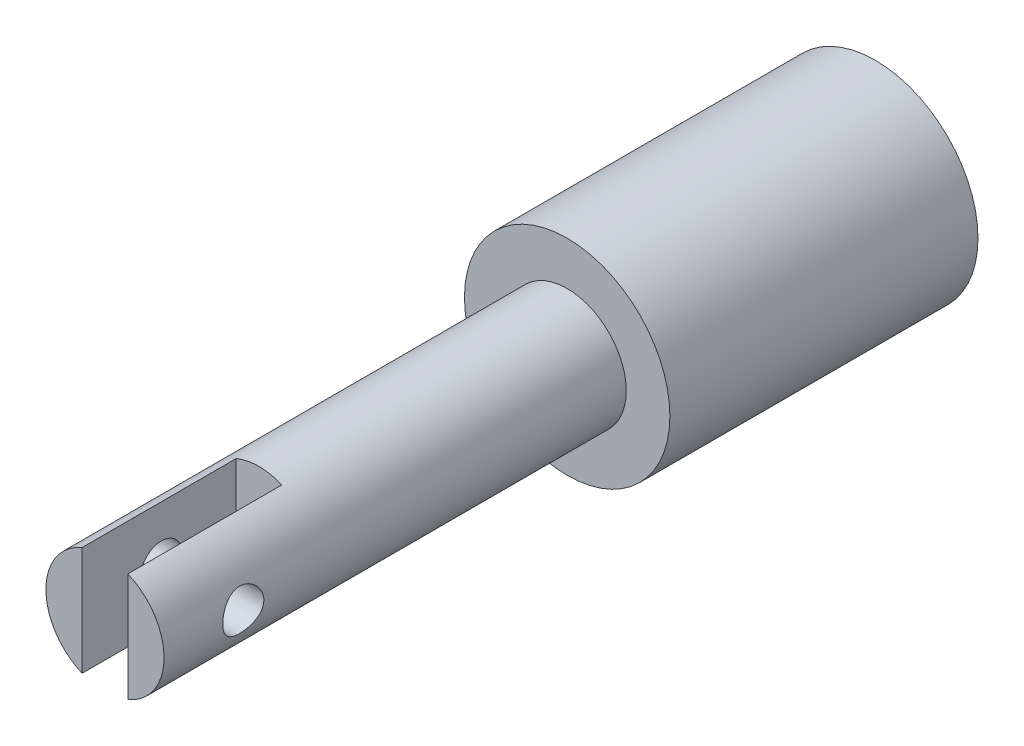
ISO-10303-21;
HEADER;
FILE_DESCRIPTION(('STEP AP214'),'2;1');
FILE_NAME('part.step','',(''),(''),'','','');
FILE_SCHEMA(('AUTOMOTIVE_DESIGN { 1 0 10303 214 1 1 1 1 }'));
ENDSEC;
DATA;
#1=APPLICATION_CONTEXT('core data for automotive mechanical design processes');
#2=APPLICATION_PROTOCOL_DEFINITION('international standard','automotive_design',2000,#1);
#3=PRODUCT_CONTEXT('',#1,'mechanical');
#4=PRODUCT('Part','Part','',(#3));
#5=PRODUCT_RELATED_PRODUCT_CATEGORY('part','',(#4));
#6=PRODUCT_DEFINITION_FORMATION('','',#4);
#7=PRODUCT_DEFINITION_CONTEXT('part definition',#1,'design');
#8=PRODUCT_DEFINITION('design','',#6,#7);
#9=PRODUCT_DEFINITION_SHAPE('','',#8);
#10=(LENGTH_UNIT() NAMED_UNIT(*) SI_UNIT(.MILLI.,.METRE.));
#11=(NAMED_UNIT(*) PLANE_ANGLE_UNIT() SI_UNIT($,.RADIAN.));
#12=(NAMED_UNIT(*) SI_UNIT($,.STERADIAN.) SOLID_ANGLE_UNIT());
#13=UNCERTAINTY_MEASURE_WITH_UNIT(LENGTH_MEASURE(1.E-05),#10,'distance_accuracy_value','');
#14=(GEOMETRIC_REPRESENTATION_CONTEXT(3) GLOBAL_UNCERTAINTY_ASSIGNED_CONTEXT((#13)) GLOBAL_UNIT_ASSIGNED_CONTEXT((#10,
#11,#12)) REPRESENTATION_CONTEXT('',''));
#15=CARTESIAN_POINT('',(0.,0.,0.));
#16=DIRECTION('',(0.,0.,1.));
#17=DIRECTION('',(1.,0.,0.));
#18=AXIS2_PLACEMENT_3D('',#15,#16,#17);
#19=CARTESIAN_POINT('',(0.,0.,60.));
#20=DIRECTION('',(0.,0.,1.));
#21=DIRECTION('',(1.,0.,0.));
#22=AXIS2_PLACEMENT_3D('',#19,#20,#21);
#23=PLANE('',#22);
#24=CARTESIAN_POINT('',(0.,0.,60.));
#25=DIRECTION('',(0.,0.,1.));
#26=DIRECTION('',(1.,0.,0.));
#27=AXIS2_PLACEMENT_3D('',#24,#25,#26);
#28=CIRCLE('',#27,5.75258948326963);
#29=CARTESIAN_POINT('',(-2.2252248524531,-5.30477710361608,60.));
#30=VERTEX_POINT('',#29);
#31=CARTESIAN_POINT('',(2.2252248524531,-5.30477710361608,60.));
#32=VERTEX_POINT('',#31);
#33=EDGE_CURVE('E108',#30,#32,#28,.T.);
#34=ORIENTED_EDGE('',*,*,#33,.T.);
#35=DIRECTION('',(0.,-1.,0.));
#36=VECTOR('',#35,1.);
#37=CARTESIAN_POINT('',(2.2252248524531,5.30477710361608,60.));
#38=LINE('',#37,#36);
#39=CARTESIAN_POINT('',(2.2252248524531,5.30477710361608,60.));
#40=VERTEX_POINT('',#39);
#41=EDGE_CURVE('E85',#40,#32,#38,.T.);
#42=ORIENTED_EDGE('',*,*,#41,.F.);
#43=CARTESIAN_POINT('',(-2.2252248524531,5.30477710361608,60.));
#44=VERTEX_POINT('',#43);
#45=EDGE_CURVE('E91',#40,#44,#28,.T.);
#46=ORIENTED_EDGE('',*,*,#45,.T.);
#47=DIRECTION('',(0.,1.,0.));
#48=VECTOR('',#47,1.);
#49=CARTESIAN_POINT('',(-2.2252248524531,5.30477710361608,60.));
#50=LINE('',#49,#48);
#51=EDGE_CURVE('E57',#30,#44,#50,.T.);
#52=ORIENTED_EDGE('',*,*,#51,.F.);
#53=EDGE_LOOP('',(#34,#42,#46,#52));
#54=FACE_BOUND('',#53,.T.);
#55=ADVANCED_FACE('F32',(#54),#23,.T.);
#56=CARTESIAN_POINT('',(0.,0.,30.));
#57=DIRECTION('',(0.,0.,-1.));
#58=DIRECTION('',(-1.,0.,0.));
#59=AXIS2_PLACEMENT_3D('',#56,#57,#58);
#60=CYLINDRICAL_SURFACE('',#59,10.);
#61=CARTESIAN_POINT('',(0.,0.,30.));
#62=DIRECTION('',(0.,0.,1.));
#63=DIRECTION('',(1.,0.,0.));
#64=AXIS2_PLACEMENT_3D('',#61,#62,#63);
#65=CIRCLE('',#64,10.);
#66=CARTESIAN_POINT('',(10.,0.,30.));
#67=VERTEX_POINT('',#66);
#68=EDGE_CURVE('E11',#67,#67,#65,.T.);
#69=ORIENTED_EDGE('',*,*,#68,.F.);
#70=EDGE_LOOP('',(#69));
#71=FACE_BOUND('',#70,.T.);
#72=CARTESIAN_POINT('',(0.,0.,0.));
#73=DIRECTION('',(0.,0.,1.));
#74=DIRECTION('',(1.,0.,0.));
#75=AXIS2_PLACEMENT_3D('',#72,#73,#74);
#76=CIRCLE('',#75,10.);
#77=CARTESIAN_POINT('',(10.,0.,0.));
#78=VERTEX_POINT('',#77);
#79=EDGE_CURVE('E41',#78,#78,#76,.T.);
#80=ORIENTED_EDGE('',*,*,#79,.T.);
#81=EDGE_LOOP('',(#80));
#82=FACE_BOUND('',#81,.T.);
#83=ADVANCED_FACE('F34',(#71,#82),#60,.T.);
#84=CARTESIAN_POINT('',(0.,0.,30.));
#85=DIRECTION('',(0.,0.,1.));
#86=DIRECTION('',(1.,0.,0.));
#87=AXIS2_PLACEMENT_3D('',#84,#85,#86);
#88=PLANE('',#87);
#89=CARTESIAN_POINT('',(0.,0.,30.));
#90=DIRECTION('',(0.,0.,1.));
#91=DIRECTION('',(1.,0.,0.));
#92=AXIS2_PLACEMENT_3D('',#89,#90,#91);
#93=CIRCLE('',#92,5.75258948326963);
#94=CARTESIAN_POINT('',(5.75258948326963,0.,30.));
#95=VERTEX_POINT('',#94);
#96=EDGE_CURVE('E105',#95,#95,#93,.T.);
#97=ORIENTED_EDGE('',*,*,#96,.F.);
#98=EDGE_LOOP('',(#97));
#99=FACE_BOUND('',#98,.T.);
#100=ORIENTED_EDGE('',*,*,#68,.T.);
#101=EDGE_LOOP('',(#100));
#102=FACE_BOUND('',#101,.T.);
#103=ADVANCED_FACE('F145',(#99,#102),#88,.T.);
#104=CARTESIAN_POINT('',(0.,0.,0.));
#105=DIRECTION('',(0.,0.,1.));
#106=DIRECTION('',(1.,0.,0.));
#107=AXIS2_PLACEMENT_3D('',#104,#105,#106);
#108=PLANE('',#107);
#109=ORIENTED_EDGE('',*,*,#79,.F.);
#110=EDGE_LOOP('',(#109));
#111=FACE_BOUND('',#110,.T.);
#112=ADVANCED_FACE('F151',(#111),#108,.F.);
#113=CARTESIAN_POINT('',(0.,0.,60.));
#114=DIRECTION('',(0.,0.,-1.));
#115=DIRECTION('',(-1.,0.,0.));
#116=AXIS2_PLACEMENT_3D('',#113,#114,#115);
#117=CYLINDRICAL_SURFACE('',#116,5.75258948326963);
#118=CARTESIAN_POINT('',(-5.75258948326963,0.,69.2843926625045));
#119=CARTESIAN_POINT('',(-5.75259053411721,-0.108855988491879,69.2843941746644));
#120=CARTESIAN_POINT('',(-5.74947169212244,-0.217701202775094,69.2754768628789));
#121=CARTESIAN_POINT('',(-5.73733861407755,-0.432169586322584,69.2401639139545));
#122=CARTESIAN_POINT('',(-5.72832426967222,-0.537792696329485,69.21376795557));
#123=CARTESIAN_POINT('',(-5.70537577643332,-0.742694046036642,69.1445231049895));
#124=CARTESIAN_POINT('',(-5.69145028382106,-0.841983088664504,69.1017031496118));
#125=CARTESIAN_POINT('',(-5.66008926714514,-1.03196805310706,69.0009620716715));
#126=CARTESIAN_POINT('',(-5.64265295974575,-1.1226620505352,68.9430375781199));
#127=CARTESIAN_POINT('',(-5.6053668531092,-1.29626382949066,68.8114675335434));
#128=CARTESIAN_POINT('',(-5.58545563224186,-1.37880745670492,68.737359023693));
#129=CARTESIAN_POINT('',(-5.54578947926593,-1.53057827327527,68.5765082083348));
#130=CARTESIAN_POINT('',(-5.52603458690332,-1.599802174233,68.4897627922685));
#131=CARTESIAN_POINT('',(-5.48822939154141,-1.7251244375781,68.3027300366945));
#132=CARTESIAN_POINT('',(-5.47025318510754,-1.78073591685119,68.2021000185026));
#133=CARTESIAN_POINT('',(-5.43898184665961,-1.87408748238633,67.9921901289735));
#134=CARTESIAN_POINT('',(-5.42568514215385,-1.91183357357567,67.8829131784846));
#135=CARTESIAN_POINT('',(-5.40592830011995,-1.96699276968032,67.6629718410679));
#136=CARTESIAN_POINT('',(-5.39923800795687,-1.98509275069389,67.5525010313599));
#137=CARTESIAN_POINT('',(-5.39277292397934,-2.00259368272225,67.3299033540334));
#138=CARTESIAN_POINT('',(-5.39299576786205,-2.00200102664568,67.217777065704));
#139=CARTESIAN_POINT('',(-5.40013115290795,-1.98266407961782,67.0010446336499));
#140=CARTESIAN_POINT('',(-5.40670674057703,-1.96483403837285,66.8963438590908));
#141=CARTESIAN_POINT('',(-5.42525248225017,-1.91302651531002,66.6915247889198));
#142=CARTESIAN_POINT('',(-5.43722333576657,-1.87904693962558,66.5914070893719));
#143=CARTESIAN_POINT('',(-5.46543821079442,-1.79533932524431,66.3965907920864));
#144=CARTESIAN_POINT('',(-5.48175183010446,-1.74535182178022,66.3020141982613));
#145=CARTESIAN_POINT('',(-5.51678692430243,-1.63122755916939,66.1223104279583));
#146=CARTESIAN_POINT('',(-5.53550914166159,-1.56708643266673,66.0371861803864));
#147=CARTESIAN_POINT('',(-5.57455843055329,-1.42215388121245,65.8736904241432));
#148=CARTESIAN_POINT('',(-5.59491608718582,-1.34062067638806,65.7959823446195));
#149=CARTESIAN_POINT('',(-5.63401240786343,-1.16543357343047,65.655160907104));
#150=CARTESIAN_POINT('',(-5.65275088796578,-1.07177830120937,65.5920492059376));
#151=CARTESIAN_POINT('',(-5.68678254845073,-0.873504585879797,65.4816143672457));
#152=CARTESIAN_POINT('',(-5.70203316251366,-0.768771392431339,65.4344832223857));
#153=CARTESIAN_POINT('',(-5.72705985953034,-0.552203916325494,65.3587194664259));
#154=CARTESIAN_POINT('',(-5.7368380186956,-0.440372344697399,65.3300798391378));
#155=CARTESIAN_POINT('',(-5.74946710663383,-0.218388190912261,65.2933204340174));
#156=CARTESIAN_POINT('',(-5.75262006728984,-0.108400881477266,65.2843052684141));
#157=CARTESIAN_POINT('',(-5.75255846954564,0.111545778297261,65.2844812926565));
#158=CARTESIAN_POINT('',(-5.74934509419839,0.221505130034496,65.2936690998531));
#159=CARTESIAN_POINT('',(-5.73711148792043,0.434596479440953,65.3292902565837));
#160=CARTESIAN_POINT('',(-5.72828054608559,0.537834347705573,65.3551618088661));
#161=CARTESIAN_POINT('',(-5.70588903145768,0.738452895680869,65.4227013494959));
#162=CARTESIAN_POINT('',(-5.69232784760204,0.835832816743127,65.4643713787842));
#163=CARTESIAN_POINT('',(-5.66137631391049,1.0249605698158,65.563586856917));
#164=CARTESIAN_POINT('',(-5.64389093838812,1.11647994969065,65.6215372755021));
#165=CARTESIAN_POINT('',(-5.60705883169998,1.28877935690095,65.7511992900248));
#166=CARTESIAN_POINT('',(-5.58771149035221,1.36955584290102,65.8229154048074));
#167=CARTESIAN_POINT('',(-5.54811269214,1.52225640453584,65.9822762160987));
#168=CARTESIAN_POINT('',(-5.52786402383469,1.59354209412099,66.070534841917));
#169=CARTESIAN_POINT('',(-5.48971400936692,1.72038568653267,66.2581873892244));
#170=CARTESIAN_POINT('',(-5.47181273576928,1.77594310321383,66.3575816547727));
#171=CARTESIAN_POINT('',(-5.44053326580354,1.86958124666382,66.5649496742323));
#172=CARTESIAN_POINT('',(-5.42715371974194,1.90766718971976,66.6729208561085));
#173=CARTESIAN_POINT('',(-5.40669251537863,1.96491835319779,66.8943250402634));
#174=CARTESIAN_POINT('',(-5.39960768319946,1.98409310942613,67.0077552595743));
#175=CARTESIAN_POINT('',(-5.39291981565268,2.00219514233583,67.2300523490607));
#176=CARTESIAN_POINT('',(-5.39292177017308,2.0021914032755,67.3388211743172));
#177=CARTESIAN_POINT('',(-5.39941854852333,1.98460348708628,67.5547202167937));
#178=CARTESIAN_POINT('',(-5.40591291786515,1.96702054055336,67.66185054818));
#179=CARTESIAN_POINT('',(-5.42435649212921,1.91555702951829,67.8690142756019));
#180=CARTESIAN_POINT('',(-5.43617964078807,1.88205216593226,67.9691531316865));
#181=CARTESIAN_POINT('',(-5.46389258527493,1.80000819760074,68.1624602332107));
#182=CARTESIAN_POINT('',(-5.47978333067681,1.75146558175931,68.2556268444187));
#183=CARTESIAN_POINT('',(-5.51476596697837,1.63808234861348,68.4370673033435));
#184=CARTESIAN_POINT('',(-5.53397272856322,1.57258625353205,68.5249092102518));
#185=CARTESIAN_POINT('',(-5.57297262672439,1.42823162209781,68.6886997536277));
#186=CARTESIAN_POINT('',(-5.59276593448987,1.34936915230496,68.7646448764286));
#187=CARTESIAN_POINT('',(-5.63174973964916,1.17637908043968,68.9058525949062));
#188=CARTESIAN_POINT('',(-5.65087586967256,1.08173418709223,68.9705016590633));
#189=CARTESIAN_POINT('',(-5.68542930940269,0.88227394560066,69.0829173707566));
#190=CARTESIAN_POINT('',(-5.70085717543276,0.777460130485929,69.1306865580161));
#191=CARTESIAN_POINT('',(-5.72605176875095,0.562278011044186,69.2070648193902));
#192=CARTESIAN_POINT('',(-5.73590350335438,0.452022628597252,69.2359626947113));
#193=CARTESIAN_POINT('',(-5.74917071482245,0.227840055244764,69.2746225666146));
#194=CARTESIAN_POINT('',(-5.75258838359301,0.113914128248559,69.28439108008));
#195=CARTESIAN_POINT('',(-5.75258948326963,0.,69.2843926625045));
#196=B_SPLINE_CURVE_WITH_KNOTS('',3,(#118,#119,#120,#121,#122,#123,#124,#125,#126,#127,#128,
#129,#130,#131,#132,#133,#134,#135,#136,#137,#138,#139,#140,#141,#142,#143,#144,#145,#146,#147,
#148,#149,#150,#151,#152,#153,#154,#155,#156,#157,#158,#159,#160,#161,#162,#163,#164,#165,#166,
#167,#168,#169,#170,#171,#172,#173,#174,#175,#176,#177,#178,#179,#180,#181,#182,#183,#184,#185,
#186,#187,#188,#189,#190,#191,#192,#193,#194,#195),.UNSPECIFIED.,.T.,.F.,(4,2,2,2,2,2,2,2,2,2,2,
2,2,2,2,2,2,2,2,2,2,2,2,2,2,2,2,2,2,2,2,2,2,2,2,2,2,2,4),(0.,0.326148429754415,
0.652302854057864,0.977885259388556,1.30354038957929,1.64014099385261,1.97682459237359,
2.32420491303538,2.67146838890515,3.00615528411285,3.34072771716524,3.65847624582909,
3.97626598339573,4.29949214814239,4.62281818997479,4.96461218942227,5.30644496665971,
5.65224999798738,5.99792374418702,6.32746284251182,6.65694070849767,6.97586546185769,
7.2948314298543,7.6225668172479,7.95040997442065,8.29452549118705,8.63865164306295,
8.98267498558225,9.32652476841024,9.65120903436534,9.97587057306303,10.2932252675554,
10.6106541156616,10.942913022336,11.2752698760539,11.6221828224625,11.9690435505738,
12.3104632384896,12.6517665932231),.UNSPECIFIED.);
#197=CARTESIAN_POINT('',(-5.75258948326963,0.,69.2843926625045));
#198=VERTEX_POINT('',#197);
#199=EDGE_CURVE('E161',#198,#198,#196,.T.);
#200=ORIENTED_EDGE('',*,*,#199,.T.);
#201=EDGE_LOOP('',(#200));
#202=FACE_BOUND('',#201,.T.);
#203=CARTESIAN_POINT('',(5.75258948326963,0.,69.2843926625045));
#204=CARTESIAN_POINT('',(5.75259053411721,0.108855988491879,69.2843941746644));
#205=CARTESIAN_POINT('',(5.74947169212244,0.217701202775094,69.2754768628789));
#206=CARTESIAN_POINT('',(5.73733861407755,0.432169586322584,69.2401639139545));
#207=CARTESIAN_POINT('',(5.72832426967222,0.537792696329485,69.21376795557));
#208=CARTESIAN_POINT('',(5.70537577643332,0.742694046036642,69.1445231049895));
#209=CARTESIAN_POINT('',(5.69145028382106,0.841983088664504,69.1017031496118));
#210=CARTESIAN_POINT('',(5.66008926714514,1.03196805310706,69.0009620716715));
#211=CARTESIAN_POINT('',(5.64265295974575,1.1226620505352,68.9430375781199));
#212=CARTESIAN_POINT('',(5.6053668531092,1.29626382949066,68.8114675335434));
#213=CARTESIAN_POINT('',(5.58545563224186,1.37880745670492,68.737359023693));
#214=CARTESIAN_POINT('',(5.54578947926593,1.53057827327527,68.5765082083348));
#215=CARTESIAN_POINT('',(5.52603458690332,1.599802174233,68.4897627922685));
#216=CARTESIAN_POINT('',(5.48822939154141,1.7251244375781,68.3027300366945));
#217=CARTESIAN_POINT('',(5.47025318510754,1.78073591685119,68.2021000185026));
#218=CARTESIAN_POINT('',(5.43898184665961,1.87408748238633,67.9921901289735));
#219=CARTESIAN_POINT('',(5.42568514215385,1.91183357357567,67.8829131784846));
#220=CARTESIAN_POINT('',(5.40592830011995,1.96699276968032,67.6629718410679));
#221=CARTESIAN_POINT('',(5.39923800795687,1.98509275069389,67.5525010313599));
#222=CARTESIAN_POINT('',(5.39277292397934,2.00259368272225,67.3299033540334));
#223=CARTESIAN_POINT('',(5.39299576786205,2.00200102664568,67.217777065704));
#224=CARTESIAN_POINT('',(5.40013115290795,1.98266407961782,67.0010446336499));
#225=CARTESIAN_POINT('',(5.40670674057703,1.96483403837285,66.8963438590908));
#226=CARTESIAN_POINT('',(5.42525248225017,1.91302651531002,66.6915247889198));
#227=CARTESIAN_POINT('',(5.43722333576657,1.87904693962558,66.5914070893719));
#228=CARTESIAN_POINT('',(5.46543821079442,1.79533932524431,66.3965907920864));
#229=CARTESIAN_POINT('',(5.48175183010446,1.74535182178022,66.3020141982613));
#230=CARTESIAN_POINT('',(5.51678692430243,1.63122755916939,66.1223104279583));
#231=CARTESIAN_POINT('',(5.53550914166159,1.56708643266673,66.0371861803864));
#232=CARTESIAN_POINT('',(5.57455843055329,1.42215388121245,65.8736904241432));
#233=CARTESIAN_POINT('',(5.59491608718582,1.34062067638806,65.7959823446195));
#234=CARTESIAN_POINT('',(5.63401240786343,1.16543357343047,65.655160907104));
#235=CARTESIAN_POINT('',(5.65275088796578,1.07177830120937,65.5920492059376));
#236=CARTESIAN_POINT('',(5.68678254845073,0.873504585879797,65.4816143672457));
#237=CARTESIAN_POINT('',(5.70203316251366,0.768771392431339,65.4344832223857));
#238=CARTESIAN_POINT('',(5.72705985953034,0.552203916325494,65.3587194664259));
#239=CARTESIAN_POINT('',(5.7368380186956,0.440372344697399,65.3300798391378));
#240=CARTESIAN_POINT('',(5.74946710663383,0.218388190912261,65.2933204340174));
#241=CARTESIAN_POINT('',(5.75262006728984,0.108400881477266,65.2843052684141));
#242=CARTESIAN_POINT('',(5.75255846954564,-0.111545778297261,65.2844812926565));
#243=CARTESIAN_POINT('',(5.74934509419839,-0.221505130034496,65.2936690998531));
#244=CARTESIAN_POINT('',(5.73711148792043,-0.434596479440953,65.3292902565837));
#245=CARTESIAN_POINT('',(5.72828054608559,-0.537834347705573,65.3551618088661));
#246=CARTESIAN_POINT('',(5.70588903145768,-0.738452895680869,65.4227013494959));
#247=CARTESIAN_POINT('',(5.69232784760204,-0.835832816743127,65.4643713787842));
#248=CARTESIAN_POINT('',(5.66137631391049,-1.0249605698158,65.563586856917));
#249=CARTESIAN_POINT('',(5.64389093838812,-1.11647994969065,65.6215372755021));
#250=CARTESIAN_POINT('',(5.60705883169998,-1.28877935690095,65.7511992900248));
#251=CARTESIAN_POINT('',(5.58771149035221,-1.36955584290102,65.8229154048074));
#252=CARTESIAN_POINT('',(5.54811269214,-1.52225640453584,65.9822762160987));
#253=CARTESIAN_POINT('',(5.52786402383469,-1.59354209412099,66.070534841917));
#254=CARTESIAN_POINT('',(5.48971400936692,-1.72038568653267,66.2581873892244));
#255=CARTESIAN_POINT('',(5.47181273576928,-1.77594310321383,66.3575816547727));
#256=CARTESIAN_POINT('',(5.44053326580354,-1.86958124666382,66.5649496742323));
#257=CARTESIAN_POINT('',(5.42715371974194,-1.90766718971976,66.6729208561085));
#258=CARTESIAN_POINT('',(5.40669251537863,-1.96491835319779,66.8943250402634));
#259=CARTESIAN_POINT('',(5.39960768319946,-1.98409310942613,67.0077552595743));
#260=CARTESIAN_POINT('',(5.39291981565268,-2.00219514233583,67.2300523490607));
#261=CARTESIAN_POINT('',(5.39292177017308,-2.0021914032755,67.3388211743172));
#262=CARTESIAN_POINT('',(5.39941854852333,-1.98460348708628,67.5547202167937));
#263=CARTESIAN_POINT('',(5.40591291786515,-1.96702054055336,67.66185054818));
#264=CARTESIAN_POINT('',(5.42435649212921,-1.91555702951829,67.8690142756019));
#265=CARTESIAN_POINT('',(5.43617964078807,-1.88205216593226,67.9691531316865));
#266=CARTESIAN_POINT('',(5.46389258527493,-1.80000819760074,68.1624602332107));
#267=CARTESIAN_POINT('',(5.47978333067681,-1.75146558175931,68.2556268444187));
#268=CARTESIAN_POINT('',(5.51476596697837,-1.63808234861348,68.4370673033435));
#269=CARTESIAN_POINT('',(5.53397272856322,-1.57258625353205,68.5249092102518));
#270=CARTESIAN_POINT('',(5.57297262672439,-1.42823162209781,68.6886997536277));
#271=CARTESIAN_POINT('',(5.59276593448987,-1.34936915230496,68.7646448764286));
#272=CARTESIAN_POINT('',(5.63174973964916,-1.17637908043968,68.9058525949062));
#273=CARTESIAN_POINT('',(5.65087586967256,-1.08173418709223,68.9705016590633));
#274=CARTESIAN_POINT('',(5.68542930940269,-0.88227394560066,69.0829173707566));
#275=CARTESIAN_POINT('',(5.70085717543276,-0.777460130485929,69.1306865580161));
#276=CARTESIAN_POINT('',(5.72605176875095,-0.562278011044186,69.2070648193902));
#277=CARTESIAN_POINT('',(5.73590350335438,-0.452022628597252,69.2359626947113));
#278=CARTESIAN_POINT('',(5.74917071482245,-0.227840055244764,69.2746225666146));
#279=CARTESIAN_POINT('',(5.75258838359301,-0.113914128248559,69.28439108008));
#280=CARTESIAN_POINT('',(5.75258948326963,0.,69.2843926625045));
#281=B_SPLINE_CURVE_WITH_KNOTS('',3,(#203,#204,#205,#206,#207,#208,#209,#210,#211,#212,#213,
#214,#215,#216,#217,#218,#219,#220,#221,#222,#223,#224,#225,#226,#227,#228,#229,#230,#231,#232,
#233,#234,#235,#236,#237,#238,#239,#240,#241,#242,#243,#244,#245,#246,#247,#248,#249,#250,#251,
#252,#253,#254,#255,#256,#257,#258,#259,#260,#261,#262,#263,#264,#265,#266,#267,#268,#269,#270,
#271,#272,#273,#274,#275,#276,#277,#278,#279,#280),.UNSPECIFIED.,.T.,.F.,(4,2,2,2,2,2,2,2,2,2,2,
2,2,2,2,2,2,2,2,2,2,2,2,2,2,2,2,2,2,2,2,2,2,2,2,2,2,2,4),(0.,0.326148429754415,
0.652302854057864,0.977885259388556,1.30354038957929,1.64014099385261,1.97682459237359,
2.32420491303538,2.67146838890515,3.00615528411285,3.34072771716524,3.65847624582909,
3.97626598339573,4.29949214814239,4.62281818997479,4.96461218942227,5.30644496665971,
5.65224999798738,5.99792374418702,6.32746284251182,6.65694070849767,6.97586546185769,
7.2948314298543,7.6225668172479,7.95040997442065,8.29452549118705,8.63865164306295,
8.98267498558225,9.32652476841024,9.65120903436534,9.97587057306303,10.2932252675554,
10.6106541156616,10.942913022336,11.2752698760539,11.6221828224625,11.9690435505738,
12.3104632384896,12.6517665932231),.UNSPECIFIED.);
#282=CARTESIAN_POINT('',(5.75258948326963,0.,69.2843926625045));
#283=VERTEX_POINT('',#282);
#284=EDGE_CURVE('E155',#283,#283,#281,.T.);
#285=ORIENTED_EDGE('',*,*,#284,.T.);
#286=EDGE_LOOP('',(#285));
#287=FACE_BOUND('',#286,.T.);
#288=ORIENTED_EDGE('',*,*,#33,.F.);
#289=DIRECTION('',(0.,0.,-1.));
#290=VECTOR('',#289,1.);
#291=CARTESIAN_POINT('',(-2.2252248524531,-5.30477710361608,75.));
#292=LINE('',#291,#290);
#293=CARTESIAN_POINT('',(-2.2252248524531,-5.30477710361608,75.));
#294=VERTEX_POINT('',#293);
#295=EDGE_CURVE('E111',#294,#30,#292,.T.);
#296=ORIENTED_EDGE('',*,*,#295,.F.);
#297=CARTESIAN_POINT('',(0.,0.,75.));
#298=DIRECTION('',(0.,0.,1.));
#299=DIRECTION('',(1.,0.,0.));
#300=AXIS2_PLACEMENT_3D('',#297,#298,#299);
#301=CIRCLE('',#300,5.75258948326963);
#302=CARTESIAN_POINT('',(-2.2252248524531,5.30477710361608,75.));
#303=VERTEX_POINT('',#302);
#304=EDGE_CURVE('E93',#303,#294,#301,.T.);
#305=ORIENTED_EDGE('',*,*,#304,.F.);
#306=DIRECTION('',(0.,0.,-1.));
#307=VECTOR('',#306,1.);
#308=CARTESIAN_POINT('',(-2.2252248524531,5.30477710361608,75.));
#309=LINE('',#308,#307);
#310=EDGE_CURVE('E102',#303,#44,#309,.T.);
#311=ORIENTED_EDGE('',*,*,#310,.T.);
#312=ORIENTED_EDGE('',*,*,#45,.F.);
#313=DIRECTION('',(0.,0.,-1.));
#314=VECTOR('',#313,1.);
#315=CARTESIAN_POINT('',(2.2252248524531,5.30477710361608,75.));
#316=LINE('',#315,#314);
#317=CARTESIAN_POINT('',(2.2252248524531,5.30477710361608,75.));
#318=VERTEX_POINT('',#317);
#319=EDGE_CURVE('E49',#318,#40,#316,.T.);
#320=ORIENTED_EDGE('',*,*,#319,.F.);
#321=CARTESIAN_POINT('',(0.,0.,75.));
#322=DIRECTION('',(0.,0.,1.));
#323=DIRECTION('',(-1.,0.,0.));
#324=AXIS2_PLACEMENT_3D('',#321,#322,#323);
#325=CIRCLE('',#324,5.75258948326963);
#326=CARTESIAN_POINT('',(2.2252248524531,-5.30477710361608,75.));
#327=VERTEX_POINT('',#326);
#328=EDGE_CURVE('E81',#327,#318,#325,.T.);
#329=ORIENTED_EDGE('',*,*,#328,.F.);
#330=DIRECTION('',(0.,0.,-1.));
#331=VECTOR('',#330,1.);
#332=CARTESIAN_POINT('',(2.2252248524531,-5.30477710361608,75.));
#333=LINE('',#332,#331);
#334=EDGE_CURVE('E78',#327,#32,#333,.T.);
#335=ORIENTED_EDGE('',*,*,#334,.T.);
#336=EDGE_LOOP('',(#288,#296,#305,#311,#312,#320,#329,#335));
#337=FACE_BOUND('',#336,.T.);
#338=ORIENTED_EDGE('',*,*,#96,.T.);
#339=EDGE_LOOP('',(#338));
#340=FACE_BOUND('',#339,.T.);
#341=ADVANCED_FACE('F88',(#202,#287,#337,#340),#117,.T.);
#342=CARTESIAN_POINT('',(-2.2252248524531,5.30477710361608,75.));
#343=DIRECTION('',(-1.,0.,0.));
#344=DIRECTION('',(0.,0.,1.));
#345=AXIS2_PLACEMENT_3D('',#342,#343,#344);
#346=PLANE('',#345);
#347=CARTESIAN_POINT('',(-2.2252248524531,0.,67.2843926625045));
#348=DIRECTION('',(-1.,0.,0.));
#349=DIRECTION('',(0.,0.,1.));
#350=AXIS2_PLACEMENT_3D('',#347,#348,#349);
#351=CIRCLE('',#350,2.);
#352=CARTESIAN_POINT('',(-2.2252248524531,0.,69.2843926625045));
#353=VERTEX_POINT('',#352);
#354=EDGE_CURVE('E185',#353,#353,#351,.T.);
#355=ORIENTED_EDGE('',*,*,#354,.T.);
#356=EDGE_LOOP('',(#355));
#357=FACE_BOUND('',#356,.T.);
#358=ORIENTED_EDGE('',*,*,#51,.T.);
#359=ORIENTED_EDGE('',*,*,#310,.F.);
#360=DIRECTION('',(0.,1.,0.));
#361=VECTOR('',#360,1.);
#362=CARTESIAN_POINT('',(-2.2252248524531,5.30477710361608,75.));
#363=LINE('',#362,#361);
#364=EDGE_CURVE('E100',#294,#303,#363,.T.);
#365=ORIENTED_EDGE('',*,*,#364,.F.);
#366=ORIENTED_EDGE('',*,*,#295,.T.);
#367=EDGE_LOOP('',(#358,#359,#365,#366));
#368=FACE_BOUND('',#367,.T.);
#369=ADVANCED_FACE('F126',(#357,#368),#346,.F.);
#370=CARTESIAN_POINT('',(0.,0.,75.));
#371=DIRECTION('',(0.,0.,1.));
#372=DIRECTION('',(1.,0.,0.));
#373=AXIS2_PLACEMENT_3D('',#370,#371,#372);
#374=PLANE('',#373);
#375=ORIENTED_EDGE('',*,*,#304,.T.);
#376=ORIENTED_EDGE('',*,*,#364,.T.);
#377=EDGE_LOOP('',(#375,#376));
#378=FACE_BOUND('',#377,.T.);
#379=ADVANCED_FACE('F129',(#378),#374,.T.);
#380=CARTESIAN_POINT('',(2.2252248524531,5.30477710361608,75.));
#381=DIRECTION('',(1.,0.,0.));
#382=DIRECTION('',(0.,0.,-1.));
#383=AXIS2_PLACEMENT_3D('',#380,#381,#382);
#384=PLANE('',#383);
#385=CARTESIAN_POINT('',(2.2252248524531,0.,67.2843926625045));
#386=DIRECTION('',(1.,0.,0.));
#387=DIRECTION('',(0.,0.,-1.));
#388=AXIS2_PLACEMENT_3D('',#385,#386,#387);
#389=CIRCLE('',#388,2.);
#390=CARTESIAN_POINT('',(2.2252248524531,0.,65.2843926625045));
#391=VERTEX_POINT('',#390);
#392=EDGE_CURVE('E36',#391,#391,#389,.T.);
#393=ORIENTED_EDGE('',*,*,#392,.T.);
#394=EDGE_LOOP('',(#393));
#395=FACE_BOUND('',#394,.T.);
#396=ORIENTED_EDGE('',*,*,#41,.T.);
#397=ORIENTED_EDGE('',*,*,#334,.F.);
#398=DIRECTION('',(0.,-1.,0.));
#399=VECTOR('',#398,1.);
#400=CARTESIAN_POINT('',(2.2252248524531,5.30477710361608,75.));
#401=LINE('',#400,#399);
#402=EDGE_CURVE('E74',#318,#327,#401,.T.);
#403=ORIENTED_EDGE('',*,*,#402,.F.);
#404=ORIENTED_EDGE('',*,*,#319,.T.);
#405=EDGE_LOOP('',(#396,#397,#403,#404));
#406=FACE_BOUND('',#405,.T.);
#407=ADVANCED_FACE('F76',(#395,#406),#384,.F.);
#408=CARTESIAN_POINT('',(0.,0.,75.));
#409=DIRECTION('',(0.,0.,-1.));
#410=DIRECTION('',(-1.,0.,0.));
#411=AXIS2_PLACEMENT_3D('',#408,#409,#410);
#412=PLANE('',#411);
#413=ORIENTED_EDGE('',*,*,#328,.T.);
#414=ORIENTED_EDGE('',*,*,#402,.T.);
#415=EDGE_LOOP('',(#413,#414));
#416=FACE_BOUND('',#415,.T.);
#417=ADVANCED_FACE('F83',(#416),#412,.F.);
#418=CARTESIAN_POINT('',(10.,0.,67.2843926625045));
#419=DIRECTION('',(-1.,0.,0.));
#420=DIRECTION('',(0.,0.,1.));
#421=AXIS2_PLACEMENT_3D('',#418,#419,#420);
#422=CYLINDRICAL_SURFACE('',#421,2.);
#423=ORIENTED_EDGE('',*,*,#392,.F.);
#424=EDGE_LOOP('',(#423));
#425=FACE_BOUND('',#424,.T.);
#426=ORIENTED_EDGE('',*,*,#284,.F.);
#427=EDGE_LOOP('',(#426));
#428=FACE_BOUND('',#427,.T.);
#429=ADVANCED_FACE('F169',(#425,#428),#422,.F.);
#430=ORIENTED_EDGE('',*,*,#354,.F.);
#431=EDGE_LOOP('',(#430));
#432=FACE_BOUND('',#431,.T.);
#433=ORIENTED_EDGE('',*,*,#199,.F.);
#434=EDGE_LOOP('',(#433));
#435=FACE_BOUND('',#434,.T.);
#436=ADVANCED_FACE('F165',(#432,#435),#422,.F.);
#437=CLOSED_SHELL('',(#55,#83,#103,#112,#341,#369,#379,#407,#417,#429,#436));
#438=MANIFOLD_SOLID_BREP('B2',#437);
#439=ADVANCED_BREP_SHAPE_REPRESENTATION('',(#18,#438),#14);
#440=SHAPE_DEFINITION_REPRESENTATION(#9,#439);
ENDSEC;
END-ISO-10303-21;
